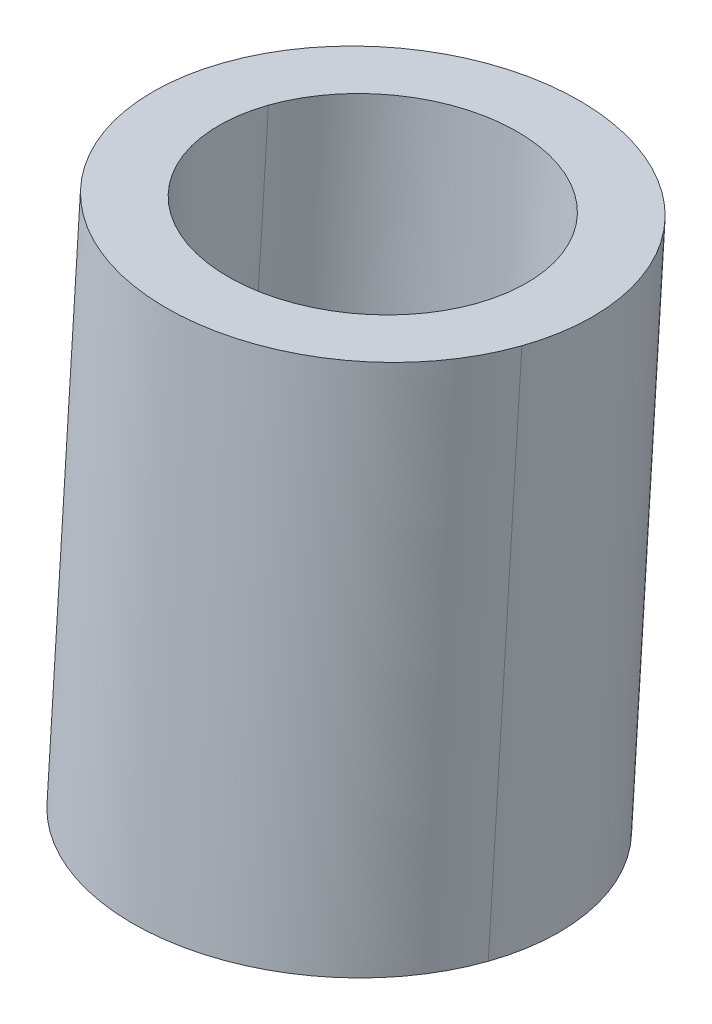
ISO-10303-21;
HEADER;
FILE_DESCRIPTION(('STEP AP214'),'2;1');
FILE_NAME('part.step','',(''),(''),'','','');
FILE_SCHEMA(('AUTOMOTIVE_DESIGN { 1 0 10303 214 1 1 1 1 }'));
ENDSEC;
DATA;
#1=APPLICATION_CONTEXT('core data for automotive mechanical design processes');
#2=APPLICATION_PROTOCOL_DEFINITION('international standard','automotive_design',2000,#1);
#3=PRODUCT_CONTEXT('',#1,'mechanical');
#4=PRODUCT('Part','Part','',(#3));
#5=PRODUCT_RELATED_PRODUCT_CATEGORY('part','',(#4));
#6=PRODUCT_DEFINITION_FORMATION('','',#4);
#7=PRODUCT_DEFINITION_CONTEXT('part definition',#1,'design');
#8=PRODUCT_DEFINITION('design','',#6,#7);
#9=PRODUCT_DEFINITION_SHAPE('','',#8);
#10=(LENGTH_UNIT() NAMED_UNIT(*) SI_UNIT(.MILLI.,.METRE.));
#11=(NAMED_UNIT(*) PLANE_ANGLE_UNIT() SI_UNIT($,.RADIAN.));
#12=(NAMED_UNIT(*) SI_UNIT($,.STERADIAN.) SOLID_ANGLE_UNIT());
#13=UNCERTAINTY_MEASURE_WITH_UNIT(LENGTH_MEASURE(1.E-05),#10,'distance_accuracy_value','');
#14=(GEOMETRIC_REPRESENTATION_CONTEXT(3) GLOBAL_UNCERTAINTY_ASSIGNED_CONTEXT((#13)) GLOBAL_UNIT_ASSIGNED_CONTEXT((#10,
#11,#12)) REPRESENTATION_CONTEXT('',''));
#15=CARTESIAN_POINT('',(0.,0.,0.));
#16=DIRECTION('',(0.,0.,1.));
#17=DIRECTION('',(1.,0.,0.));
#18=AXIS2_PLACEMENT_3D('',#15,#16,#17);
#19=CARTESIAN_POINT('',(74.025365407897,-7.98315239825258,21.0189198264482));
#20=DIRECTION('',(0.,0.997894049781517,-0.0648649783060444));
#21=DIRECTION('',(0.96857270068141,0.0161339065531891,0.248206810047697));
#22=AXIS2_PLACEMENT_3D('',#19,#20,#21);
#23=CYLINDRICAL_SURFACE('',#22,1.4);
#24=DIRECTION('',(0.,0.997894049781517,-0.0648649783060444));
#25=VECTOR('',#24,1.);
#26=CARTESIAN_POINT('',(72.669363626943,-8.00573986742705,20.6714302923814));
#27=LINE('',#26,#25);
#28=CARTESIAN_POINT('',(72.669363626943,-8.00573986742705,20.6714302923814));
#29=VERTEX_POINT('',#28);
#30=CARTESIAN_POINT('',(72.669363626943,-3.01626961851946,20.3471054008512));
#31=VERTEX_POINT('',#30);
#32=EDGE_CURVE('E101',#29,#31,#27,.T.);
#33=ORIENTED_EDGE('',*,*,#32,.F.);
#34=CARTESIAN_POINT('',(74.025365407897,-7.98315239825258,21.0189198264482));
#35=DIRECTION('',(0.,-0.997894049781517,0.0648649783060444));
#36=DIRECTION('',(-0.96857270068141,-0.0161339065531891,-0.248206810047697));
#37=AXIS2_PLACEMENT_3D('',#34,#35,#36);
#38=CIRCLE('',#37,1.4);
#39=CARTESIAN_POINT('',(75.381367188851,-7.96056492907812,21.366409360515));
#40=VERTEX_POINT('',#39);
#41=EDGE_CURVE('E96',#29,#40,#38,.T.);
#42=ORIENTED_EDGE('',*,*,#41,.T.);
#43=DIRECTION('',(0.,0.997894049781517,-0.0648649783060444));
#44=VECTOR('',#43,1.);
#45=CARTESIAN_POINT('',(75.381367188851,-7.96056492907812,21.366409360515));
#46=LINE('',#45,#44);
#47=CARTESIAN_POINT('',(75.381367188851,-2.97109468017054,21.0420844689848));
#48=VERTEX_POINT('',#47);
#49=EDGE_CURVE('E98',#40,#48,#46,.T.);
#50=ORIENTED_EDGE('',*,*,#49,.T.);
#51=CARTESIAN_POINT('',(74.025365407897,-2.993682149345,20.694594934918));
#52=DIRECTION('',(0.,-0.997894049781517,0.0648649783060444));
#53=DIRECTION('',(-0.96857270068141,-0.0161339065531891,-0.248206810047697));
#54=AXIS2_PLACEMENT_3D('',#51,#52,#53);
#55=CIRCLE('',#54,1.4);
#56=EDGE_CURVE('E11',#31,#48,#55,.T.);
#57=ORIENTED_EDGE('',*,*,#56,.F.);
#58=EDGE_LOOP('',(#33,#42,#50,#57));
#59=FACE_BOUND('',#58,.T.);
#60=ADVANCED_FACE('F46',(#59),#23,.F.);
#61=CARTESIAN_POINT('',(74.025365407897,-7.98315239825258,21.0189198264482));
#62=DIRECTION('',(0.,0.997894049781517,-0.0648649783060444));
#63=DIRECTION('',(0.96857270068141,0.0161339065531891,0.248206810047697));
#64=AXIS2_PLACEMENT_3D('',#61,#62,#63);
#65=CYLINDRICAL_SURFACE('',#64,2.);
#66=DIRECTION('',(0.,0.997894049781517,-0.0648649783060444));
#67=VECTOR('',#66,1.);
#68=CARTESIAN_POINT('',(72.0882200065342,-8.01542021135896,20.5225062063528));
#69=LINE('',#68,#67);
#70=CARTESIAN_POINT('',(72.0882200065342,-8.01542021135896,20.5225062063528));
#71=VERTEX_POINT('',#70);
#72=CARTESIAN_POINT('',(72.0882200065342,-3.02594996245138,20.1981813148226));
#73=VERTEX_POINT('',#72);
#74=EDGE_CURVE('E129',#71,#73,#69,.T.);
#75=ORIENTED_EDGE('',*,*,#74,.F.);
#76=CARTESIAN_POINT('',(74.025365407897,-7.98315239825258,21.0189198264482));
#77=DIRECTION('',(0.,-0.997894049781517,0.0648649783060444));
#78=DIRECTION('',(-0.96857270068141,-0.0161339065531891,-0.248206810047697));
#79=AXIS2_PLACEMENT_3D('',#76,#77,#78);
#80=CIRCLE('',#79,2.);
#81=CARTESIAN_POINT('',(75.9625108092598,-7.95088458514621,21.5153334465436));
#82=VERTEX_POINT('',#81);
#83=EDGE_CURVE('E106',#82,#71,#80,.T.);
#84=ORIENTED_EDGE('',*,*,#83,.F.);
#85=DIRECTION('',(0.,0.997894049781517,-0.0648649783060444));
#86=VECTOR('',#85,1.);
#87=CARTESIAN_POINT('',(75.9625108092598,-7.95088458514621,21.5153334465436));
#88=LINE('',#87,#86);
#89=CARTESIAN_POINT('',(75.9625108092598,-2.96141433623862,21.1910085550134));
#90=VERTEX_POINT('',#89);
#91=EDGE_CURVE('E137',#82,#90,#88,.T.);
#92=ORIENTED_EDGE('',*,*,#91,.T.);
#93=CARTESIAN_POINT('',(74.025365407897,-2.993682149345,20.694594934918));
#94=DIRECTION('',(0.,-0.997894049781517,0.0648649783060444));
#95=DIRECTION('',(-0.96857270068141,-0.0161339065531891,-0.248206810047697));
#96=AXIS2_PLACEMENT_3D('',#93,#94,#95);
#97=CIRCLE('',#96,2.);
#98=EDGE_CURVE('E49',#90,#73,#97,.T.);
#99=ORIENTED_EDGE('',*,*,#98,.T.);
#100=EDGE_LOOP('',(#75,#84,#92,#99));
#101=FACE_BOUND('',#100,.T.);
#102=ADVANCED_FACE('F144',(#101),#65,.T.);
#103=CARTESIAN_POINT('',(74.025365407897,-2.993682149345,20.694594934918));
#104=DIRECTION('',(0.,-0.997894049781517,0.0648649783060444));
#105=DIRECTION('',(0.248730624360412,-0.062826447217526,-0.966532934790793));
#106=AXIS2_PLACEMENT_3D('',#103,#104,#105);
#107=PLANE('',#106);
#108=CARTESIAN_POINT('',(74.025365407897,-2.993682149345,20.694594934918));
#109=DIRECTION('',(0.,-0.997894049781517,0.0648649783060444));
#110=DIRECTION('',(-0.96857270068141,-0.0161339065531891,-0.248206810047697));
#111=AXIS2_PLACEMENT_3D('',#108,#109,#110);
#112=CIRCLE('',#111,1.4);
#113=EDGE_CURVE('E112',#48,#31,#112,.T.);
#114=ORIENTED_EDGE('',*,*,#113,.T.);
#115=ORIENTED_EDGE('',*,*,#56,.T.);
#116=EDGE_LOOP('',(#114,#115));
#117=FACE_BOUND('',#116,.T.);
#118=ORIENTED_EDGE('',*,*,#98,.F.);
#119=CARTESIAN_POINT('',(74.025365407897,-2.993682149345,20.694594934918));
#120=DIRECTION('',(0.,-0.997894049781517,0.0648649783060444));
#121=DIRECTION('',(-0.96857270068141,-0.0161339065531891,-0.248206810047697));
#122=AXIS2_PLACEMENT_3D('',#119,#120,#121);
#123=CIRCLE('',#122,2.);
#124=EDGE_CURVE('E133',#73,#90,#123,.T.);
#125=ORIENTED_EDGE('',*,*,#124,.F.);
#126=EDGE_LOOP('',(#118,#125));
#127=FACE_BOUND('',#126,.T.);
#128=ADVANCED_FACE('F147',(#117,#127),#107,.F.);
#129=CARTESIAN_POINT('',(74.025365407897,-7.98315239825258,21.0189198264482));
#130=DIRECTION('',(0.,-0.997894049781517,0.0648649783060444));
#131=DIRECTION('',(0.248730624360412,-0.062826447217526,-0.966532934790793));
#132=AXIS2_PLACEMENT_3D('',#129,#130,#131);
#133=PLANE('',#132);
#134=CARTESIAN_POINT('',(74.025365407897,-7.98315239825258,21.0189198264482));
#135=DIRECTION('',(0.,-0.997894049781517,0.0648649783060444));
#136=DIRECTION('',(-0.96857270068141,-0.0161339065531891,-0.248206810047697));
#137=AXIS2_PLACEMENT_3D('',#134,#135,#136);
#138=CIRCLE('',#137,1.4);
#139=EDGE_CURVE('E110',#40,#29,#138,.T.);
#140=ORIENTED_EDGE('',*,*,#139,.F.);
#141=ORIENTED_EDGE('',*,*,#41,.F.);
#142=EDGE_LOOP('',(#140,#141));
#143=FACE_BOUND('',#142,.T.);
#144=ORIENTED_EDGE('',*,*,#83,.T.);
#145=CARTESIAN_POINT('',(74.025365407897,-7.98315239825258,21.0189198264482));
#146=DIRECTION('',(0.,-0.997894049781517,0.0648649783060444));
#147=DIRECTION('',(-0.96857270068141,-0.0161339065531891,-0.248206810047697));
#148=AXIS2_PLACEMENT_3D('',#145,#146,#147);
#149=CIRCLE('',#148,2.);
#150=EDGE_CURVE('E114',#71,#82,#149,.T.);
#151=ORIENTED_EDGE('',*,*,#150,.T.);
#152=EDGE_LOOP('',(#144,#151));
#153=FACE_BOUND('',#152,.T.);
#154=ADVANCED_FACE('F116',(#143,#153),#133,.T.);
#155=CARTESIAN_POINT('',(74.025365407897,-7.98315239825258,21.0189198264482));
#156=DIRECTION('',(0.,0.997894049781517,-0.0648649783060444));
#157=DIRECTION('',(0.96857270068141,0.0161339065531891,0.248206810047697));
#158=AXIS2_PLACEMENT_3D('',#155,#156,#157);
#159=CYLINDRICAL_SURFACE('',#158,2.);
#160=ORIENTED_EDGE('',*,*,#150,.F.);
#161=ORIENTED_EDGE('',*,*,#74,.T.);
#162=ORIENTED_EDGE('',*,*,#124,.T.);
#163=ORIENTED_EDGE('',*,*,#91,.F.);
#164=EDGE_LOOP('',(#160,#161,#162,#163));
#165=FACE_BOUND('',#164,.T.);
#166=ADVANCED_FACE('F146',(#165),#159,.T.);
#167=CARTESIAN_POINT('',(74.025365407897,-7.98315239825258,21.0189198264482));
#168=DIRECTION('',(0.,0.997894049781517,-0.0648649783060444));
#169=DIRECTION('',(0.96857270068141,0.0161339065531891,0.248206810047697));
#170=AXIS2_PLACEMENT_3D('',#167,#168,#169);
#171=CYLINDRICAL_SURFACE('',#170,1.4);
#172=ORIENTED_EDGE('',*,*,#139,.T.);
#173=ORIENTED_EDGE('',*,*,#32,.T.);
#174=ORIENTED_EDGE('',*,*,#113,.F.);
#175=ORIENTED_EDGE('',*,*,#49,.F.);
#176=EDGE_LOOP('',(#172,#173,#174,#175));
#177=FACE_BOUND('',#176,.T.);
#178=ADVANCED_FACE('F109',(#177),#171,.F.);
#179=CLOSED_SHELL('',(#60,#102,#128,#154,#166,#178));
#180=MANIFOLD_SOLID_BREP('B2',#179);
#181=ADVANCED_BREP_SHAPE_REPRESENTATION('',(#18,#180),#14);
#182=SHAPE_DEFINITION_REPRESENTATION(#9,#181);
ENDSEC;
END-ISO-10303-21;
